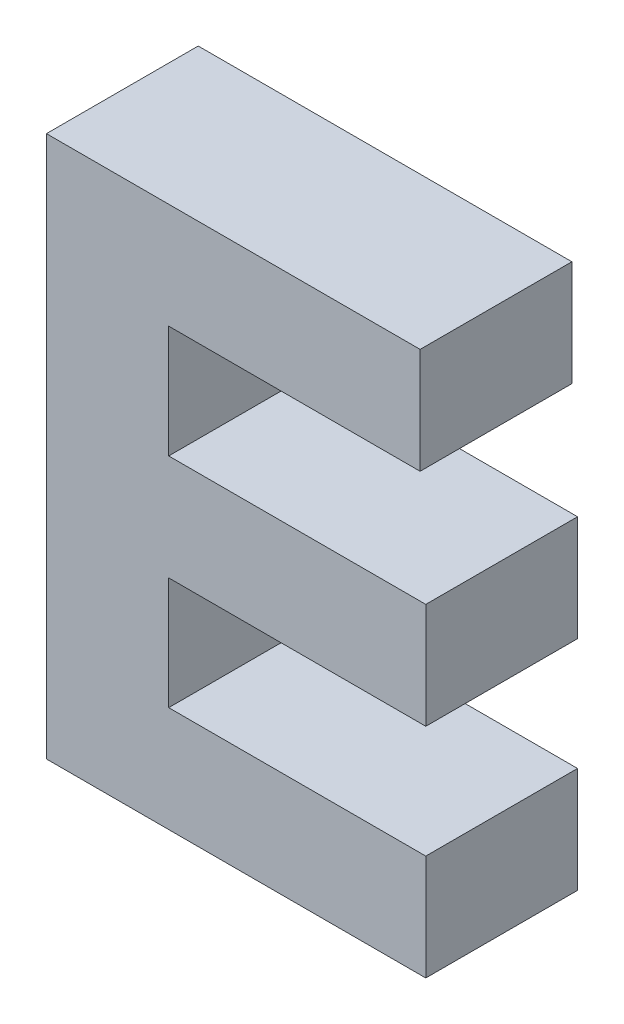
ISO-10303-21;
HEADER;
FILE_DESCRIPTION(('STEP AP214'),'2;1');
FILE_NAME('part.step','',(''),(''),'','','');
FILE_SCHEMA(('AUTOMOTIVE_DESIGN { 1 0 10303 214 1 1 1 1 }'));
ENDSEC;
DATA;
#1=APPLICATION_CONTEXT('core data for automotive mechanical design processes');
#2=APPLICATION_PROTOCOL_DEFINITION('international standard','automotive_design',2000,#1);
#3=PRODUCT_CONTEXT('',#1,'mechanical');
#4=PRODUCT('Part','Part','',(#3));
#5=PRODUCT_RELATED_PRODUCT_CATEGORY('part','',(#4));
#6=PRODUCT_DEFINITION_FORMATION('','',#4);
#7=PRODUCT_DEFINITION_CONTEXT('part definition',#1,'design');
#8=PRODUCT_DEFINITION('design','',#6,#7);
#9=PRODUCT_DEFINITION_SHAPE('','',#8);
#10=(LENGTH_UNIT() NAMED_UNIT(*) SI_UNIT(.MILLI.,.METRE.));
#11=(NAMED_UNIT(*) PLANE_ANGLE_UNIT() SI_UNIT($,.RADIAN.));
#12=(NAMED_UNIT(*) SI_UNIT($,.STERADIAN.) SOLID_ANGLE_UNIT());
#13=UNCERTAINTY_MEASURE_WITH_UNIT(LENGTH_MEASURE(1.E-05),#10,'distance_accuracy_value','');
#14=(GEOMETRIC_REPRESENTATION_CONTEXT(3) GLOBAL_UNCERTAINTY_ASSIGNED_CONTEXT((#13)) GLOBAL_UNIT_ASSIGNED_CONTEXT((#10,
#11,#12)) REPRESENTATION_CONTEXT('',''));
#15=CARTESIAN_POINT('',(0.,0.,0.));
#16=DIRECTION('',(0.,0.,1.));
#17=DIRECTION('',(1.,0.,0.));
#18=AXIS2_PLACEMENT_3D('',#15,#16,#17);
#19=CARTESIAN_POINT('',(-14.9133456902735,0.,35.));
#20=DIRECTION('',(1.,0.,0.));
#21=DIRECTION('',(0.,1.,0.));
#22=AXIS2_PLACEMENT_3D('',#19,#20,#21);
#23=PLANE('',#22);
#24=DIRECTION('',(0.,-1.,0.));
#25=VECTOR('',#24,1.);
#26=CARTESIAN_POINT('',(-14.9133456902735,0.,0.));
#27=LINE('',#26,#25);
#28=CARTESIAN_POINT('',(-14.9133456902735,-40.7132174494222,0.));
#29=VERTEX_POINT('',#28);
#30=CARTESIAN_POINT('',(-14.9133456902735,-65.0632174494222,0.));
#31=VERTEX_POINT('',#30);
#32=EDGE_CURVE('E153',#29,#31,#27,.T.);
#33=ORIENTED_EDGE('',*,*,#32,.F.);
#34=DIRECTION('',(0.,0.,-1.));
#35=VECTOR('',#34,1.);
#36=CARTESIAN_POINT('',(-14.9133456902735,-40.7132174494222,35.));
#37=LINE('',#36,#35);
#38=CARTESIAN_POINT('',(-14.9133456902735,-40.7132174494222,35.));
#39=VERTEX_POINT('',#38);
#40=EDGE_CURVE('E11',#39,#29,#37,.T.);
#41=ORIENTED_EDGE('',*,*,#40,.F.);
#42=DIRECTION('',(0.,-1.,0.));
#43=VECTOR('',#42,1.);
#44=CARTESIAN_POINT('',(-14.9133456902735,0.,35.));
#45=LINE('',#44,#43);
#46=CARTESIAN_POINT('',(-14.9133456902735,-65.0632174494222,35.));
#47=VERTEX_POINT('',#46);
#48=EDGE_CURVE('E185',#39,#47,#45,.T.);
#49=ORIENTED_EDGE('',*,*,#48,.T.);
#50=DIRECTION('',(0.,0.,-1.));
#51=VECTOR('',#50,1.);
#52=CARTESIAN_POINT('',(-14.9133456902735,-65.0632174494222,35.));
#53=LINE('',#52,#51);
#54=EDGE_CURVE('E97',#47,#31,#53,.T.);
#55=ORIENTED_EDGE('',*,*,#54,.T.);
#56=EDGE_LOOP('',(#33,#41,#49,#55));
#57=FACE_BOUND('',#56,.T.);
#58=ADVANCED_FACE('F35',(#57),#23,.T.);
#59=CARTESIAN_POINT('',(0.,-40.7132174494222,35.));
#60=DIRECTION('',(0.,1.,0.));
#61=DIRECTION('',(0.,0.,1.));
#62=AXIS2_PLACEMENT_3D('',#59,#60,#61);
#63=PLANE('',#62);
#64=DIRECTION('',(1.,0.,0.));
#65=VECTOR('',#64,1.);
#66=CARTESIAN_POINT('',(0.,-40.7132174494222,0.));
#67=LINE('',#66,#65);
#68=CARTESIAN_POINT('',(-74.1933456902735,-40.7132174494222,0.));
#69=VERTEX_POINT('',#68);
#70=EDGE_CURVE('E156',#69,#29,#67,.T.);
#71=ORIENTED_EDGE('',*,*,#70,.F.);
#72=DIRECTION('',(0.,0.,-1.));
#73=VECTOR('',#72,1.);
#74=CARTESIAN_POINT('',(-74.1933456902735,-40.7132174494222,35.));
#75=LINE('',#74,#73);
#76=CARTESIAN_POINT('',(-74.1933456902735,-40.7132174494222,35.));
#77=VERTEX_POINT('',#76);
#78=EDGE_CURVE('E43',#77,#69,#75,.T.);
#79=ORIENTED_EDGE('',*,*,#78,.F.);
#80=DIRECTION('',(1.,0.,0.));
#81=VECTOR('',#80,1.);
#82=CARTESIAN_POINT('',(0.,-40.7132174494222,35.));
#83=LINE('',#82,#81);
#84=EDGE_CURVE('E222',#77,#39,#83,.T.);
#85=ORIENTED_EDGE('',*,*,#84,.T.);
#86=ORIENTED_EDGE('',*,*,#40,.T.);
#87=EDGE_LOOP('',(#71,#79,#85,#86));
#88=FACE_BOUND('',#87,.T.);
#89=ADVANCED_FACE('F210',(#88),#63,.T.);
#90=CARTESIAN_POINT('',(-74.1933456902735,0.,35.));
#91=DIRECTION('',(1.,0.,0.));
#92=DIRECTION('',(0.,1.,0.));
#93=AXIS2_PLACEMENT_3D('',#90,#91,#92);
#94=PLANE('',#93);
#95=DIRECTION('',(0.,-1.,0.));
#96=VECTOR('',#95,1.);
#97=CARTESIAN_POINT('',(-74.1933456902735,0.,0.));
#98=LINE('',#97,#96);
#99=CARTESIAN_POINT('',(-74.1933456902735,-14.7932174494222,0.));
#100=VERTEX_POINT('',#99);
#101=EDGE_CURVE('E160',#100,#69,#98,.T.);
#102=ORIENTED_EDGE('',*,*,#101,.F.);
#103=DIRECTION('',(0.,0.,-1.));
#104=VECTOR('',#103,1.);
#105=CARTESIAN_POINT('',(-74.1933456902735,-14.7932174494222,35.));
#106=LINE('',#105,#104);
#107=CARTESIAN_POINT('',(-74.1933456902735,-14.7932174494222,35.));
#108=VERTEX_POINT('',#107);
#109=EDGE_CURVE('E199',#108,#100,#106,.T.);
#110=ORIENTED_EDGE('',*,*,#109,.F.);
#111=DIRECTION('',(0.,-1.,0.));
#112=VECTOR('',#111,1.);
#113=CARTESIAN_POINT('',(-74.1933456902735,0.,35.));
#114=LINE('',#113,#112);
#115=EDGE_CURVE('E206',#108,#77,#114,.T.);
#116=ORIENTED_EDGE('',*,*,#115,.T.);
#117=ORIENTED_EDGE('',*,*,#78,.T.);
#118=EDGE_LOOP('',(#102,#110,#116,#117));
#119=FACE_BOUND('',#118,.T.);
#120=ADVANCED_FACE('F204',(#119),#94,.T.);
#121=CARTESIAN_POINT('',(0.,-14.7932174494222,35.));
#122=DIRECTION('',(0.,-1.,0.));
#123=DIRECTION('',(1.,0.,0.));
#124=AXIS2_PLACEMENT_3D('',#121,#122,#123);
#125=PLANE('',#124);
#126=DIRECTION('',(-1.,0.,0.));
#127=VECTOR('',#126,1.);
#128=CARTESIAN_POINT('',(0.,-14.7932174494222,0.));
#129=LINE('',#128,#127);
#130=CARTESIAN_POINT('',(-14.9100535343447,-14.7932174494222,0.));
#131=VERTEX_POINT('',#130);
#132=EDGE_CURVE('E163',#131,#100,#129,.T.);
#133=ORIENTED_EDGE('',*,*,#132,.F.);
#134=DIRECTION('',(0.,0.,-1.));
#135=VECTOR('',#134,1.);
#136=CARTESIAN_POINT('',(-14.9100535343447,-14.7932174494222,35.));
#137=LINE('',#136,#135);
#138=CARTESIAN_POINT('',(-14.9100535343447,-14.7932174494222,35.));
#139=VERTEX_POINT('',#138);
#140=EDGE_CURVE('E197',#139,#131,#137,.T.);
#141=ORIENTED_EDGE('',*,*,#140,.F.);
#142=DIRECTION('',(-1.,0.,0.));
#143=VECTOR('',#142,1.);
#144=CARTESIAN_POINT('',(0.,-14.7932174494222,35.));
#145=LINE('',#144,#143);
#146=EDGE_CURVE('E219',#139,#108,#145,.T.);
#147=ORIENTED_EDGE('',*,*,#146,.T.);
#148=ORIENTED_EDGE('',*,*,#109,.T.);
#149=EDGE_LOOP('',(#133,#141,#147,#148));
#150=FACE_BOUND('',#149,.T.);
#151=ADVANCED_FACE('F216',(#150),#125,.T.);
#152=CARTESIAN_POINT('',(-14.9100535343447,0.,35.));
#153=DIRECTION('',(1.,0.,0.));
#154=DIRECTION('',(0.,1.,0.));
#155=AXIS2_PLACEMENT_3D('',#152,#153,#154);
#156=PLANE('',#155);
#157=DIRECTION('',(0.,-1.,0.));
#158=VECTOR('',#157,1.);
#159=CARTESIAN_POINT('',(-14.9100535343447,0.,0.));
#160=LINE('',#159,#158);
#161=CARTESIAN_POINT('',(-14.9100535343447,9.55678255057776,0.));
#162=VERTEX_POINT('',#161);
#163=EDGE_CURVE('E166',#162,#131,#160,.T.);
#164=ORIENTED_EDGE('',*,*,#163,.F.);
#165=DIRECTION('',(0.,0.,-1.));
#166=VECTOR('',#165,1.);
#167=CARTESIAN_POINT('',(-14.9100535343447,9.55678255057776,35.));
#168=LINE('',#167,#166);
#169=CARTESIAN_POINT('',(-14.9100535343447,9.55678255057776,35.));
#170=VERTEX_POINT('',#169);
#171=EDGE_CURVE('E195',#170,#162,#168,.T.);
#172=ORIENTED_EDGE('',*,*,#171,.F.);
#173=DIRECTION('',(0.,-1.,0.));
#174=VECTOR('',#173,1.);
#175=CARTESIAN_POINT('',(-14.9100535343447,0.,35.));
#176=LINE('',#175,#174);
#177=EDGE_CURVE('E224',#170,#139,#176,.T.);
#178=ORIENTED_EDGE('',*,*,#177,.T.);
#179=ORIENTED_EDGE('',*,*,#140,.T.);
#180=EDGE_LOOP('',(#164,#172,#178,#179));
#181=FACE_BOUND('',#180,.T.);
#182=ADVANCED_FACE('F299',(#181),#156,.T.);
#183=CARTESIAN_POINT('',(0.,9.55678255057776,35.));
#184=DIRECTION('',(0.,1.,0.));
#185=DIRECTION('',(0.,0.,1.));
#186=AXIS2_PLACEMENT_3D('',#183,#184,#185);
#187=PLANE('',#186);
#188=DIRECTION('',(1.,0.,0.));
#189=VECTOR('',#188,1.);
#190=CARTESIAN_POINT('',(0.,9.55678255057776,0.));
#191=LINE('',#190,#189);
#192=CARTESIAN_POINT('',(-74.1933456902736,9.55678255057776,0.));
#193=VERTEX_POINT('',#192);
#194=EDGE_CURVE('E169',#193,#162,#191,.T.);
#195=ORIENTED_EDGE('',*,*,#194,.F.);
#196=DIRECTION('',(0.,0.,-1.));
#197=VECTOR('',#196,1.);
#198=CARTESIAN_POINT('',(-74.1933456902736,9.55678255057776,35.));
#199=LINE('',#198,#197);
#200=CARTESIAN_POINT('',(-74.1933456902736,9.55678255057776,35.));
#201=VERTEX_POINT('',#200);
#202=EDGE_CURVE('E193',#201,#193,#199,.T.);
#203=ORIENTED_EDGE('',*,*,#202,.F.);
#204=DIRECTION('',(1.,0.,0.));
#205=VECTOR('',#204,1.);
#206=CARTESIAN_POINT('',(0.,9.55678255057776,35.));
#207=LINE('',#206,#205);
#208=EDGE_CURVE('E230',#201,#170,#207,.T.);
#209=ORIENTED_EDGE('',*,*,#208,.T.);
#210=ORIENTED_EDGE('',*,*,#171,.T.);
#211=EDGE_LOOP('',(#195,#203,#209,#210));
#212=FACE_BOUND('',#211,.T.);
#213=ADVANCED_FACE('F302',(#212),#187,.T.);
#214=CARTESIAN_POINT('',(-74.1933456902736,0.,35.));
#215=DIRECTION('',(1.,0.,0.));
#216=DIRECTION('',(0.,0.,-1.));
#217=AXIS2_PLACEMENT_3D('',#214,#215,#216);
#218=PLANE('',#217);
#219=DIRECTION('',(0.,-1.,0.));
#220=VECTOR('',#219,1.);
#221=CARTESIAN_POINT('',(-74.1933456902736,0.,0.));
#222=LINE('',#221,#220);
#223=CARTESIAN_POINT('',(-74.1933456902736,35.4802592530867,0.));
#224=VERTEX_POINT('',#223);
#225=EDGE_CURVE('E172',#224,#193,#222,.T.);
#226=ORIENTED_EDGE('',*,*,#225,.F.);
#227=DIRECTION('',(0.,0.,-1.));
#228=VECTOR('',#227,1.);
#229=CARTESIAN_POINT('',(-74.1933456902736,35.4802592530867,35.));
#230=LINE('',#229,#228);
#231=CARTESIAN_POINT('',(-74.1933456902736,35.4802592530867,35.));
#232=VERTEX_POINT('',#231);
#233=EDGE_CURVE('E191',#232,#224,#230,.T.);
#234=ORIENTED_EDGE('',*,*,#233,.F.);
#235=DIRECTION('',(0.,-1.,0.));
#236=VECTOR('',#235,1.);
#237=CARTESIAN_POINT('',(-74.1933456902736,0.,35.));
#238=LINE('',#237,#236);
#239=EDGE_CURVE('E233',#232,#201,#238,.T.);
#240=ORIENTED_EDGE('',*,*,#239,.T.);
#241=ORIENTED_EDGE('',*,*,#202,.T.);
#242=EDGE_LOOP('',(#226,#234,#240,#241));
#243=FACE_BOUND('',#242,.T.);
#244=ADVANCED_FACE('F306',(#243),#218,.T.);
#245=CARTESIAN_POINT('',(0.,35.4802592530867,35.));
#246=DIRECTION('',(0.,-1.,0.));
#247=DIRECTION('',(0.,0.,-1.));
#248=AXIS2_PLACEMENT_3D('',#245,#246,#247);
#249=PLANE('',#248);
#250=DIRECTION('',(-1.,0.,0.));
#251=VECTOR('',#250,1.);
#252=CARTESIAN_POINT('',(0.,35.4802592530867,0.));
#253=LINE('',#252,#251);
#254=CARTESIAN_POINT('',(-16.2157120999283,35.4802592530867,0.));
#255=VERTEX_POINT('',#254);
#256=EDGE_CURVE('E175',#255,#224,#253,.T.);
#257=ORIENTED_EDGE('',*,*,#256,.F.);
#258=DIRECTION('',(0.,0.,-1.));
#259=VECTOR('',#258,1.);
#260=CARTESIAN_POINT('',(-16.2157120999283,35.4802592530867,35.));
#261=LINE('',#260,#259);
#262=CARTESIAN_POINT('',(-16.2157120999283,35.4802592530867,35.));
#263=VERTEX_POINT('',#262);
#264=EDGE_CURVE('E189',#263,#255,#261,.T.);
#265=ORIENTED_EDGE('',*,*,#264,.F.);
#266=DIRECTION('',(-1.,0.,0.));
#267=VECTOR('',#266,1.);
#268=CARTESIAN_POINT('',(0.,35.4802592530867,35.));
#269=LINE('',#268,#267);
#270=EDGE_CURVE('E148',#263,#232,#269,.T.);
#271=ORIENTED_EDGE('',*,*,#270,.T.);
#272=ORIENTED_EDGE('',*,*,#233,.T.);
#273=EDGE_LOOP('',(#257,#265,#271,#272));
#274=FACE_BOUND('',#273,.T.);
#275=ADVANCED_FACE('F238',(#274),#249,.T.);
#276=CARTESIAN_POINT('',(-16.2157120999283,0.,35.));
#277=DIRECTION('',(1.,0.,0.));
#278=DIRECTION('',(0.,1.,0.));
#279=AXIS2_PLACEMENT_3D('',#276,#277,#278);
#280=PLANE('',#279);
#281=DIRECTION('',(0.,-1.,0.));
#282=VECTOR('',#281,1.);
#283=CARTESIAN_POINT('',(-16.2157120999283,0.,0.));
#284=LINE('',#283,#282);
#285=CARTESIAN_POINT('',(-16.2157120999283,59.8298432434914,0.));
#286=VERTEX_POINT('',#285);
#287=EDGE_CURVE('E178',#286,#255,#284,.T.);
#288=ORIENTED_EDGE('',*,*,#287,.F.);
#289=DIRECTION('',(0.,0.,-1.));
#290=VECTOR('',#289,1.);
#291=CARTESIAN_POINT('',(-16.2157120999283,59.8298432434914,35.));
#292=LINE('',#291,#290);
#293=CARTESIAN_POINT('',(-16.2157120999283,59.8298432434914,35.));
#294=VERTEX_POINT('',#293);
#295=EDGE_CURVE('E136',#294,#286,#292,.T.);
#296=ORIENTED_EDGE('',*,*,#295,.F.);
#297=DIRECTION('',(0.,-1.,0.));
#298=VECTOR('',#297,1.);
#299=CARTESIAN_POINT('',(-16.2157120999283,0.,35.));
#300=LINE('',#299,#298);
#301=EDGE_CURVE('E146',#294,#263,#300,.T.);
#302=ORIENTED_EDGE('',*,*,#301,.T.);
#303=ORIENTED_EDGE('',*,*,#264,.T.);
#304=EDGE_LOOP('',(#288,#296,#302,#303));
#305=FACE_BOUND('',#304,.T.);
#306=ADVANCED_FACE('F244',(#305),#280,.T.);
#307=CARTESIAN_POINT('',(0.,59.8298432434914,35.));
#308=DIRECTION('',(0.,1.,0.));
#309=DIRECTION('',(0.,0.,1.));
#310=AXIS2_PLACEMENT_3D('',#307,#308,#309);
#311=PLANE('',#310);
#312=DIRECTION('',(1.,0.,0.));
#313=VECTOR('',#312,1.);
#314=CARTESIAN_POINT('',(0.,59.8298432434914,0.));
#315=LINE('',#314,#313);
#316=CARTESIAN_POINT('',(-102.387525880759,59.8298432434914,0.));
#317=VERTEX_POINT('',#316);
#318=EDGE_CURVE('E135',#317,#286,#315,.T.);
#319=ORIENTED_EDGE('',*,*,#318,.F.);
#320=DIRECTION('',(0.,0.,-1.));
#321=VECTOR('',#320,1.);
#322=CARTESIAN_POINT('',(-102.387525880759,59.8298432434914,35.));
#323=LINE('',#322,#321);
#324=CARTESIAN_POINT('',(-102.387525880759,59.8298432434914,35.));
#325=VERTEX_POINT('',#324);
#326=EDGE_CURVE('E129',#325,#317,#323,.T.);
#327=ORIENTED_EDGE('',*,*,#326,.F.);
#328=DIRECTION('',(1.,0.,0.));
#329=VECTOR('',#328,1.);
#330=CARTESIAN_POINT('',(0.,59.8298432434914,35.));
#331=LINE('',#330,#329);
#332=EDGE_CURVE('E133',#325,#294,#331,.T.);
#333=ORIENTED_EDGE('',*,*,#332,.T.);
#334=ORIENTED_EDGE('',*,*,#295,.T.);
#335=EDGE_LOOP('',(#319,#327,#333,#334));
#336=FACE_BOUND('',#335,.T.);
#337=ADVANCED_FACE('F131',(#336),#311,.T.);
#338=CARTESIAN_POINT('',(-102.387525880759,0.,35.));
#339=DIRECTION('',(1.,0.,0.));
#340=DIRECTION('',(0.,1.,0.));
#341=AXIS2_PLACEMENT_3D('',#338,#339,#340);
#342=PLANE('',#341);
#343=DIRECTION('',(0.,-1.,0.));
#344=VECTOR('',#343,1.);
#345=CARTESIAN_POINT('',(-102.387525880759,0.,0.));
#346=LINE('',#345,#344);
#347=CARTESIAN_POINT('',(-102.387525880758,-65.0632174494222,0.));
#348=VERTEX_POINT('',#347);
#349=EDGE_CURVE('E90',#317,#348,#346,.T.);
#350=ORIENTED_EDGE('',*,*,#349,.T.);
#351=DIRECTION('',(0.,0.,-1.));
#352=VECTOR('',#351,1.);
#353=CARTESIAN_POINT('',(-102.387525880758,-65.0632174494222,35.));
#354=LINE('',#353,#352);
#355=CARTESIAN_POINT('',(-102.387525880758,-65.0632174494222,35.));
#356=VERTEX_POINT('',#355);
#357=EDGE_CURVE('E137',#356,#348,#354,.T.);
#358=ORIENTED_EDGE('',*,*,#357,.F.);
#359=DIRECTION('',(0.,-1.,0.));
#360=VECTOR('',#359,1.);
#361=CARTESIAN_POINT('',(-102.387525880759,0.,35.));
#362=LINE('',#361,#360);
#363=EDGE_CURVE('E139',#325,#356,#362,.T.);
#364=ORIENTED_EDGE('',*,*,#363,.F.);
#365=ORIENTED_EDGE('',*,*,#326,.T.);
#366=EDGE_LOOP('',(#350,#358,#364,#365));
#367=FACE_BOUND('',#366,.T.);
#368=ADVANCED_FACE('F140',(#367),#342,.F.);
#369=CARTESIAN_POINT('',(0.,-65.0632174494222,35.));
#370=DIRECTION('',(0.,1.,0.));
#371=DIRECTION('',(0.,0.,1.));
#372=AXIS2_PLACEMENT_3D('',#369,#370,#371);
#373=PLANE('',#372);
#374=CARTESIAN_POINT('',(-55.30006580031,-65.0632174494222,15.9918555845024));
#375=DIRECTION('',(0.,-1.,0.));
#376=DIRECTION('',(0.,0.,-1.));
#377=AXIS2_PLACEMENT_3D('',#374,#375,#376);
#378=CIRCLE('',#377,9.96301374606035);
#379=CARTESIAN_POINT('',(-55.30006580031,-65.0632174494222,6.02884183844209));
#380=VERTEX_POINT('',#379);
#381=EDGE_CURVE('E255',#380,#380,#378,.T.);
#382=ORIENTED_EDGE('',*,*,#381,.F.);
#383=EDGE_LOOP('',(#382));
#384=FACE_BOUND('',#383,.T.);
#385=CARTESIAN_POINT('',(-86.6286303441086,-65.0632174494222,15.9918555845024));
#386=DIRECTION('',(0.,-1.,0.));
#387=DIRECTION('',(0.,0.,-1.));
#388=AXIS2_PLACEMENT_3D('',#385,#386,#387);
#389=CIRCLE('',#388,9.96301374606035);
#390=CARTESIAN_POINT('',(-86.6286303441086,-65.0632174494222,6.02884183844209));
#391=VERTEX_POINT('',#390);
#392=EDGE_CURVE('E249',#391,#391,#389,.T.);
#393=ORIENTED_EDGE('',*,*,#392,.F.);
#394=EDGE_LOOP('',(#393));
#395=FACE_BOUND('',#394,.T.);
#396=DIRECTION('',(1.,0.,0.));
#397=VECTOR('',#396,1.);
#398=CARTESIAN_POINT('',(0.,-65.0632174494222,0.));
#399=LINE('',#398,#397);
#400=EDGE_CURVE('E183',#348,#31,#399,.T.);
#401=ORIENTED_EDGE('',*,*,#400,.T.);
#402=ORIENTED_EDGE('',*,*,#54,.F.);
#403=DIRECTION('',(1.,0.,0.));
#404=VECTOR('',#403,1.);
#405=CARTESIAN_POINT('',(0.,-65.0632174494222,35.));
#406=LINE('',#405,#404);
#407=EDGE_CURVE('E51',#356,#47,#406,.T.);
#408=ORIENTED_EDGE('',*,*,#407,.F.);
#409=ORIENTED_EDGE('',*,*,#357,.T.);
#410=EDGE_LOOP('',(#401,#402,#408,#409));
#411=FACE_BOUND('',#410,.T.);
#412=ADVANCED_FACE('F247',(#384,#395,#411),#373,.F.);
#413=CARTESIAN_POINT('',(0.,0.,35.));
#414=DIRECTION('',(0.,0.,1.));
#415=DIRECTION('',(1.,0.,0.));
#416=AXIS2_PLACEMENT_3D('',#413,#414,#415);
#417=PLANE('',#416);
#418=ORIENTED_EDGE('',*,*,#48,.F.);
#419=ORIENTED_EDGE('',*,*,#84,.F.);
#420=ORIENTED_EDGE('',*,*,#115,.F.);
#421=ORIENTED_EDGE('',*,*,#146,.F.);
#422=ORIENTED_EDGE('',*,*,#177,.F.);
#423=ORIENTED_EDGE('',*,*,#208,.F.);
#424=ORIENTED_EDGE('',*,*,#239,.F.);
#425=ORIENTED_EDGE('',*,*,#270,.F.);
#426=ORIENTED_EDGE('',*,*,#301,.F.);
#427=ORIENTED_EDGE('',*,*,#332,.F.);
#428=ORIENTED_EDGE('',*,*,#363,.T.);
#429=ORIENTED_EDGE('',*,*,#407,.T.);
#430=EDGE_LOOP('',(#418,#419,#420,#421,#422,#423,#424,#425,#426,#427,#428,#429));
#431=FACE_BOUND('',#430,.T.);
#432=ADVANCED_FACE('F143',(#431),#417,.T.);
#433=CARTESIAN_POINT('',(0.,0.,0.));
#434=DIRECTION('',(0.,0.,1.));
#435=DIRECTION('',(1.,0.,0.));
#436=AXIS2_PLACEMENT_3D('',#433,#434,#435);
#437=PLANE('',#436);
#438=ORIENTED_EDGE('',*,*,#32,.T.);
#439=ORIENTED_EDGE('',*,*,#400,.F.);
#440=ORIENTED_EDGE('',*,*,#349,.F.);
#441=ORIENTED_EDGE('',*,*,#318,.T.);
#442=ORIENTED_EDGE('',*,*,#287,.T.);
#443=ORIENTED_EDGE('',*,*,#256,.T.);
#444=ORIENTED_EDGE('',*,*,#225,.T.);
#445=ORIENTED_EDGE('',*,*,#194,.T.);
#446=ORIENTED_EDGE('',*,*,#163,.T.);
#447=ORIENTED_EDGE('',*,*,#132,.T.);
#448=ORIENTED_EDGE('',*,*,#101,.T.);
#449=ORIENTED_EDGE('',*,*,#70,.T.);
#450=EDGE_LOOP('',(#438,#439,#440,#441,#442,#443,#444,#445,#446,#447,#448,#449));
#451=FACE_BOUND('',#450,.T.);
#452=ADVANCED_FACE('F212',(#451),#437,.F.);
#453=CARTESIAN_POINT('',(-86.6286303441086,-55.0632174494222,15.9918555845024));
#454=DIRECTION('',(0.,-1.,0.));
#455=DIRECTION('',(0.,0.,-1.));
#456=AXIS2_PLACEMENT_3D('',#453,#454,#455);
#457=CYLINDRICAL_SURFACE('',#456,9.96301374606035);
#458=CARTESIAN_POINT('',(-86.6286303441086,-55.0632174494222,15.9918555845024));
#459=DIRECTION('',(0.,-1.,0.));
#460=DIRECTION('',(0.,0.,-1.));
#461=AXIS2_PLACEMENT_3D('',#458,#459,#460);
#462=CIRCLE('',#461,9.96301374606035);
#463=CARTESIAN_POINT('',(-86.6286303441086,-55.0632174494222,6.02884183844209));
#464=VERTEX_POINT('',#463);
#465=EDGE_CURVE('E157',#464,#464,#462,.T.);
#466=ORIENTED_EDGE('',*,*,#465,.F.);
#467=EDGE_LOOP('',(#466));
#468=FACE_BOUND('',#467,.T.);
#469=ORIENTED_EDGE('',*,*,#392,.T.);
#470=EDGE_LOOP('',(#469));
#471=FACE_BOUND('',#470,.T.);
#472=ADVANCED_FACE('F275',(#468,#471),#457,.F.);
#473=CARTESIAN_POINT('',(-86.6286303441086,-55.0632174494222,15.9918555845024));
#474=DIRECTION('',(0.,-1.,0.));
#475=DIRECTION('',(0.,0.,-1.));
#476=AXIS2_PLACEMENT_3D('',#473,#474,#475);
#477=PLANE('',#476);
#478=ORIENTED_EDGE('',*,*,#465,.T.);
#479=EDGE_LOOP('',(#478));
#480=FACE_BOUND('',#479,.T.);
#481=ADVANCED_FACE('F266',(#480),#477,.T.);
#482=CARTESIAN_POINT('',(-55.30006580031,-55.0632174494222,15.9918555845024));
#483=DIRECTION('',(0.,-1.,0.));
#484=DIRECTION('',(0.,0.,-1.));
#485=AXIS2_PLACEMENT_3D('',#482,#483,#484);
#486=CYLINDRICAL_SURFACE('',#485,9.96301374606035);
#487=CARTESIAN_POINT('',(-55.30006580031,-55.0632174494222,15.9918555845024));
#488=DIRECTION('',(0.,-1.,0.));
#489=DIRECTION('',(0.,0.,-1.));
#490=AXIS2_PLACEMENT_3D('',#487,#488,#489);
#491=CIRCLE('',#490,9.96301374606035);
#492=CARTESIAN_POINT('',(-55.30006580031,-55.0632174494222,6.02884183844209));
#493=VERTEX_POINT('',#492);
#494=EDGE_CURVE('E252',#493,#493,#491,.T.);
#495=ORIENTED_EDGE('',*,*,#494,.F.);
#496=EDGE_LOOP('',(#495));
#497=FACE_BOUND('',#496,.T.);
#498=ORIENTED_EDGE('',*,*,#381,.T.);
#499=EDGE_LOOP('',(#498));
#500=FACE_BOUND('',#499,.T.);
#501=ADVANCED_FACE('F263',(#497,#500),#486,.F.);
#502=CARTESIAN_POINT('',(-55.30006580031,-55.0632174494222,15.9918555845024));
#503=DIRECTION('',(0.,-1.,0.));
#504=DIRECTION('',(0.,0.,-1.));
#505=AXIS2_PLACEMENT_3D('',#502,#503,#504);
#506=PLANE('',#505);
#507=ORIENTED_EDGE('',*,*,#494,.T.);
#508=EDGE_LOOP('',(#507));
#509=FACE_BOUND('',#508,.T.);
#510=ADVANCED_FACE('F261',(#509),#506,.T.);
#511=CLOSED_SHELL('',(#58,#89,#120,#151,#182,#213,#244,#275,#306,#337,#368,#412,#432,#452,#472,
#481,#501,#510));
#512=MANIFOLD_SOLID_BREP('B2',#511);
#513=ADVANCED_BREP_SHAPE_REPRESENTATION('',(#18,#512),#14);
#514=SHAPE_DEFINITION_REPRESENTATION(#9,#513);
ENDSEC;
END-ISO-10303-21;
